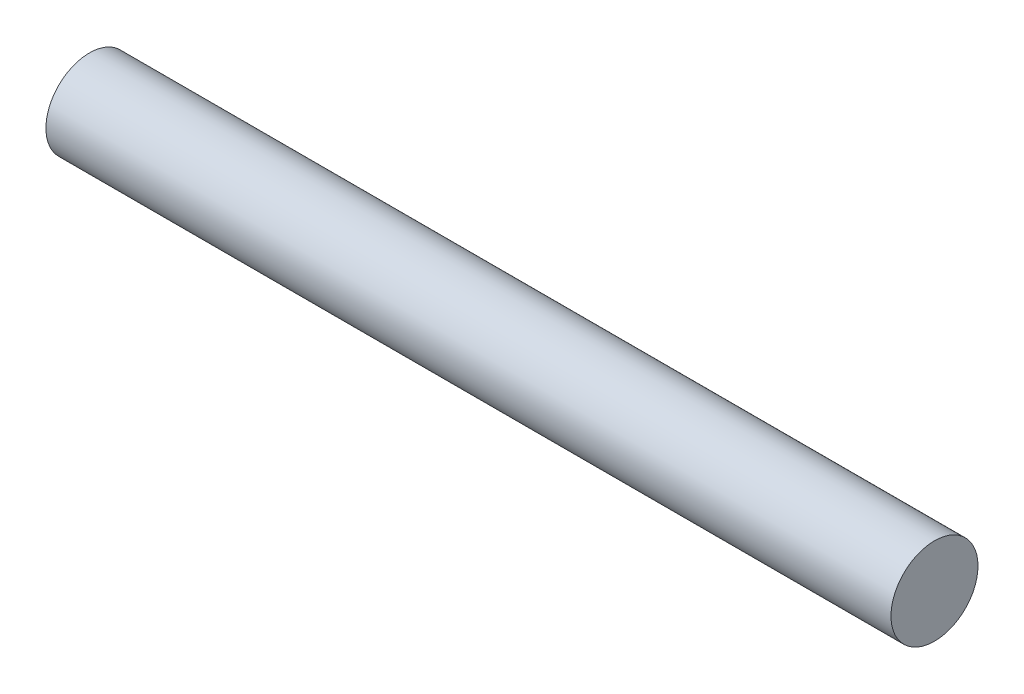
ISO-10303-21;
HEADER;
FILE_DESCRIPTION(('STEP AP214'),'2;1');
FILE_NAME('part.step','',(''),(''),'','','');
FILE_SCHEMA(('AUTOMOTIVE_DESIGN { 1 0 10303 214 1 1 1 1 }'));
ENDSEC;
DATA;
#1=APPLICATION_CONTEXT('core data for automotive mechanical design processes');
#2=APPLICATION_PROTOCOL_DEFINITION('international standard','automotive_design',2000,#1);
#3=PRODUCT_CONTEXT('',#1,'mechanical');
#4=PRODUCT('Part','Part','',(#3));
#5=PRODUCT_RELATED_PRODUCT_CATEGORY('part','',(#4));
#6=PRODUCT_DEFINITION_FORMATION('','',#4);
#7=PRODUCT_DEFINITION_CONTEXT('part definition',#1,'design');
#8=PRODUCT_DEFINITION('design','',#6,#7);
#9=PRODUCT_DEFINITION_SHAPE('','',#8);
#10=(LENGTH_UNIT() NAMED_UNIT(*) SI_UNIT(.MILLI.,.METRE.));
#11=(NAMED_UNIT(*) PLANE_ANGLE_UNIT() SI_UNIT($,.RADIAN.));
#12=(NAMED_UNIT(*) SI_UNIT($,.STERADIAN.) SOLID_ANGLE_UNIT());
#13=UNCERTAINTY_MEASURE_WITH_UNIT(LENGTH_MEASURE(1.E-05),#10,'distance_accuracy_value','');
#14=(GEOMETRIC_REPRESENTATION_CONTEXT(3) GLOBAL_UNCERTAINTY_ASSIGNED_CONTEXT((#13)) GLOBAL_UNIT_ASSIGNED_CONTEXT((#10,
#11,#12)) REPRESENTATION_CONTEXT('',''));
#15=CARTESIAN_POINT('',(0.,0.,0.));
#16=DIRECTION('',(0.,0.,1.));
#17=DIRECTION('',(1.,0.,0.));
#18=AXIS2_PLACEMENT_3D('',#15,#16,#17);
#19=CARTESIAN_POINT('',(185.,0.,0.));
#20=DIRECTION('',(-1.,0.,0.));
#21=DIRECTION('',(0.,0.,1.));
#22=AXIS2_PLACEMENT_3D('',#19,#20,#21);
#23=CYLINDRICAL_SURFACE('',#22,19.05);
#24=CARTESIAN_POINT('',(185.,0.,0.));
#25=DIRECTION('',(1.,0.,0.));
#26=DIRECTION('',(0.,0.,-1.));
#27=AXIS2_PLACEMENT_3D('',#24,#25,#26);
#28=CIRCLE('',#27,19.05);
#29=CARTESIAN_POINT('',(185.,0.,-19.05));
#30=VERTEX_POINT('',#29);
#31=EDGE_CURVE('E10',#30,#30,#28,.T.);
#32=ORIENTED_EDGE('',*,*,#31,.F.);
#33=EDGE_LOOP('',(#32));
#34=FACE_BOUND('',#33,.T.);
#35=CARTESIAN_POINT('',(-185.,0.,0.));
#36=DIRECTION('',(1.,0.,0.));
#37=DIRECTION('',(0.,0.,-1.));
#38=AXIS2_PLACEMENT_3D('',#35,#36,#37);
#39=CIRCLE('',#38,19.05);
#40=CARTESIAN_POINT('',(-185.,0.,-19.05));
#41=VERTEX_POINT('',#40);
#42=EDGE_CURVE('E42',#41,#41,#39,.T.);
#43=ORIENTED_EDGE('',*,*,#42,.T.);
#44=EDGE_LOOP('',(#43));
#45=FACE_BOUND('',#44,.T.);
#46=ADVANCED_FACE('F36',(#34,#45),#23,.T.);
#47=CARTESIAN_POINT('',(185.,0.,0.));
#48=DIRECTION('',(1.,0.,0.));
#49=DIRECTION('',(0.,0.,-1.));
#50=AXIS2_PLACEMENT_3D('',#47,#48,#49);
#51=PLANE('',#50);
#52=ORIENTED_EDGE('',*,*,#31,.T.);
#53=EDGE_LOOP('',(#52));
#54=FACE_BOUND('',#53,.T.);
#55=ADVANCED_FACE('F51',(#54),#51,.T.);
#56=CARTESIAN_POINT('',(-185.,0.,0.));
#57=DIRECTION('',(1.,0.,0.));
#58=DIRECTION('',(0.,0.,-1.));
#59=AXIS2_PLACEMENT_3D('',#56,#57,#58);
#60=PLANE('',#59);
#61=ORIENTED_EDGE('',*,*,#42,.F.);
#62=EDGE_LOOP('',(#61));
#63=FACE_BOUND('',#62,.T.);
#64=ADVANCED_FACE('F49',(#63),#60,.F.);
#65=CLOSED_SHELL('',(#46,#55,#64));
#66=MANIFOLD_SOLID_BREP('B2',#65);
#67=ADVANCED_BREP_SHAPE_REPRESENTATION('',(#18,#66),#14);
#68=SHAPE_DEFINITION_REPRESENTATION(#9,#67);
ENDSEC;
END-ISO-10303-21;
